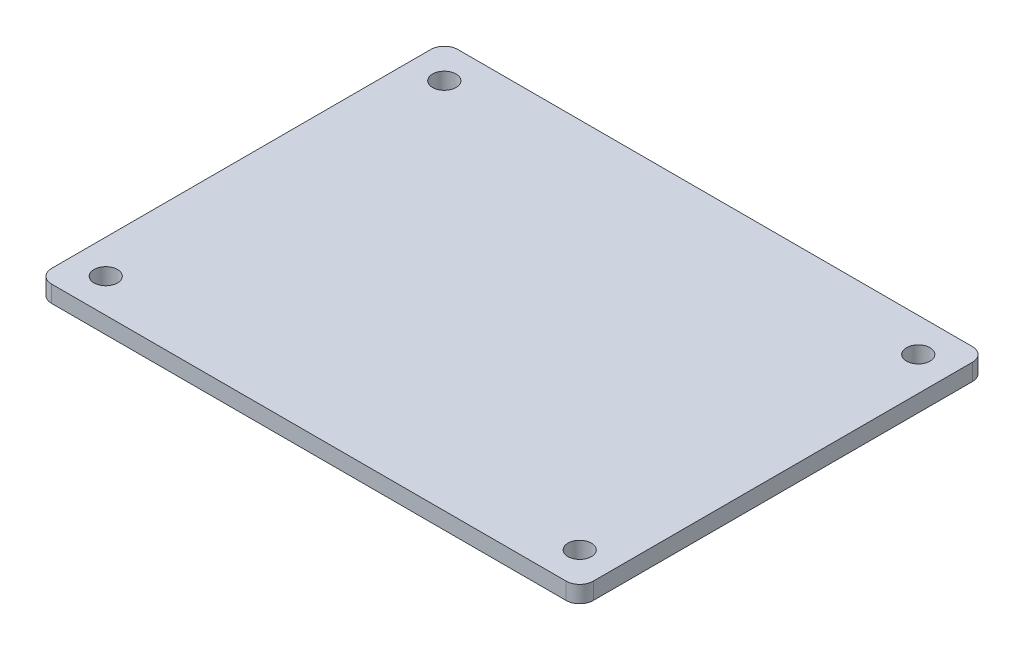
ISO-10303-21;
HEADER;
FILE_DESCRIPTION(('STEP AP214'),'2;1');
FILE_NAME('part.step','',(''),(''),'','','');
FILE_SCHEMA(('AUTOMOTIVE_DESIGN { 1 0 10303 214 1 1 1 1 }'));
ENDSEC;
DATA;
#1=APPLICATION_CONTEXT('core data for automotive mechanical design processes');
#2=APPLICATION_PROTOCOL_DEFINITION('international standard','automotive_design',2000,#1);
#3=PRODUCT_CONTEXT('',#1,'mechanical');
#4=PRODUCT('Part','Part','',(#3));
#5=PRODUCT_RELATED_PRODUCT_CATEGORY('part','',(#4));
#6=PRODUCT_DEFINITION_FORMATION('','',#4);
#7=PRODUCT_DEFINITION_CONTEXT('part definition',#1,'design');
#8=PRODUCT_DEFINITION('design','',#6,#7);
#9=PRODUCT_DEFINITION_SHAPE('','',#8);
#10=(LENGTH_UNIT() NAMED_UNIT(*) SI_UNIT(.MILLI.,.METRE.));
#11=(NAMED_UNIT(*) PLANE_ANGLE_UNIT() SI_UNIT($,.RADIAN.));
#12=(NAMED_UNIT(*) SI_UNIT($,.STERADIAN.) SOLID_ANGLE_UNIT());
#13=UNCERTAINTY_MEASURE_WITH_UNIT(LENGTH_MEASURE(1.E-05),#10,'distance_accuracy_value','');
#14=(GEOMETRIC_REPRESENTATION_CONTEXT(3) GLOBAL_UNCERTAINTY_ASSIGNED_CONTEXT((#13)) GLOBAL_UNIT_ASSIGNED_CONTEXT((#10,
#11,#12)) REPRESENTATION_CONTEXT('',''));
#15=CARTESIAN_POINT('',(0.,0.,0.));
#16=DIRECTION('',(0.,0.,1.));
#17=DIRECTION('',(1.,0.,0.));
#18=AXIS2_PLACEMENT_3D('',#15,#16,#17);
#19=CARTESIAN_POINT('',(25.4,1.5748,0.));
#20=DIRECTION('',(1.,0.,0.));
#21=DIRECTION('',(0.,0.,-1.));
#22=AXIS2_PLACEMENT_3D('',#19,#20,#21);
#23=PLANE('',#22);
#24=DIRECTION('',(0.,0.,1.));
#25=VECTOR('',#24,1.);
#26=CARTESIAN_POINT('',(25.4,0.,0.));
#27=LINE('',#26,#25);
#28=CARTESIAN_POINT('',(25.4,0.,-17.78));
#29=VERTEX_POINT('',#28);
#30=CARTESIAN_POINT('',(25.4,0.,17.78));
#31=VERTEX_POINT('',#30);
#32=EDGE_CURVE('E148',#29,#31,#27,.T.);
#33=ORIENTED_EDGE('',*,*,#32,.F.);
#34=DIRECTION('',(0.,-1.,0.));
#35=VECTOR('',#34,1.);
#36=CARTESIAN_POINT('',(25.4,1.5748,-17.78));
#37=LINE('',#36,#35);
#38=CARTESIAN_POINT('',(25.4,1.5748,-17.78));
#39=VERTEX_POINT('',#38);
#40=EDGE_CURVE('E181',#29,#39,#37,.F.);
#41=ORIENTED_EDGE('',*,*,#40,.T.);
#42=DIRECTION('',(0.,0.,1.));
#43=VECTOR('',#42,1.);
#44=CARTESIAN_POINT('',(25.4,1.5748,0.));
#45=LINE('',#44,#43);
#46=CARTESIAN_POINT('',(25.4,1.5748,17.78));
#47=VERTEX_POINT('',#46);
#48=EDGE_CURVE('E192',#39,#47,#45,.T.);
#49=ORIENTED_EDGE('',*,*,#48,.T.);
#50=DIRECTION('',(0.,-1.,0.));
#51=VECTOR('',#50,1.);
#52=CARTESIAN_POINT('',(25.4,0.,17.78));
#53=LINE('',#52,#51);
#54=EDGE_CURVE('E177',#47,#31,#53,.T.);
#55=ORIENTED_EDGE('',*,*,#54,.T.);
#56=EDGE_LOOP('',(#33,#41,#49,#55));
#57=FACE_BOUND('',#56,.T.);
#58=ADVANCED_FACE('F45',(#57),#23,.T.);
#59=CARTESIAN_POINT('',(0.,1.5748,-19.05));
#60=DIRECTION('',(0.,0.,-1.));
#61=DIRECTION('',(-1.,0.,0.));
#62=AXIS2_PLACEMENT_3D('',#59,#60,#61);
#63=PLANE('',#62);
#64=DIRECTION('',(1.,0.,0.));
#65=VECTOR('',#64,1.);
#66=CARTESIAN_POINT('',(0.,0.,-19.05));
#67=LINE('',#66,#65);
#68=CARTESIAN_POINT('',(-24.13,0.,-19.05));
#69=VERTEX_POINT('',#68);
#70=CARTESIAN_POINT('',(24.13,0.,-19.05));
#71=VERTEX_POINT('',#70);
#72=EDGE_CURVE('E142',#69,#71,#67,.T.);
#73=ORIENTED_EDGE('',*,*,#72,.F.);
#74=DIRECTION('',(0.,-1.,0.));
#75=VECTOR('',#74,1.);
#76=CARTESIAN_POINT('',(-24.13,1.5748,-19.05));
#77=LINE('',#76,#75);
#78=CARTESIAN_POINT('',(-24.13,1.5748,-19.05));
#79=VERTEX_POINT('',#78);
#80=EDGE_CURVE('E117',#69,#79,#77,.F.);
#81=ORIENTED_EDGE('',*,*,#80,.T.);
#82=DIRECTION('',(1.,0.,0.));
#83=VECTOR('',#82,1.);
#84=CARTESIAN_POINT('',(0.,1.5748,-19.05));
#85=LINE('',#84,#83);
#86=CARTESIAN_POINT('',(24.13,1.5748,-19.05));
#87=VERTEX_POINT('',#86);
#88=EDGE_CURVE('E188',#79,#87,#85,.T.);
#89=ORIENTED_EDGE('',*,*,#88,.T.);
#90=DIRECTION('',(0.,-1.,0.));
#91=VECTOR('',#90,1.);
#92=CARTESIAN_POINT('',(24.13,1.5748,-19.05));
#93=LINE('',#92,#91);
#94=EDGE_CURVE('E123',#87,#71,#93,.T.);
#95=ORIENTED_EDGE('',*,*,#94,.T.);
#96=EDGE_LOOP('',(#73,#81,#89,#95));
#97=FACE_BOUND('',#96,.T.);
#98=ADVANCED_FACE('F243',(#97),#63,.T.);
#99=CARTESIAN_POINT('',(-25.4,1.5748,0.));
#100=DIRECTION('',(1.,0.,0.));
#101=DIRECTION('',(0.,0.,-1.));
#102=AXIS2_PLACEMENT_3D('',#99,#100,#101);
#103=PLANE('',#102);
#104=DIRECTION('',(0.,0.,1.));
#105=VECTOR('',#104,1.);
#106=CARTESIAN_POINT('',(-25.4,1.5748,0.));
#107=LINE('',#106,#105);
#108=CARTESIAN_POINT('',(-25.4,1.5748,-17.78));
#109=VERTEX_POINT('',#108);
#110=CARTESIAN_POINT('',(-25.4,1.5748,17.78));
#111=VERTEX_POINT('',#110);
#112=EDGE_CURVE('E132',#109,#111,#107,.T.);
#113=ORIENTED_EDGE('',*,*,#112,.F.);
#114=DIRECTION('',(0.,-1.,0.));
#115=VECTOR('',#114,1.);
#116=CARTESIAN_POINT('',(-25.4,0.,-17.78));
#117=LINE('',#116,#115);
#118=CARTESIAN_POINT('',(-25.4,0.,-17.78));
#119=VERTEX_POINT('',#118);
#120=EDGE_CURVE('E116',#109,#119,#117,.T.);
#121=ORIENTED_EDGE('',*,*,#120,.T.);
#122=DIRECTION('',(0.,0.,1.));
#123=VECTOR('',#122,1.);
#124=CARTESIAN_POINT('',(-25.4,0.,0.));
#125=LINE('',#124,#123);
#126=CARTESIAN_POINT('',(-25.4,0.,17.78));
#127=VERTEX_POINT('',#126);
#128=EDGE_CURVE('E130',#119,#127,#125,.T.);
#129=ORIENTED_EDGE('',*,*,#128,.T.);
#130=DIRECTION('',(0.,-1.,0.));
#131=VECTOR('',#130,1.);
#132=CARTESIAN_POINT('',(-25.4,1.5748,17.78));
#133=LINE('',#132,#131);
#134=EDGE_CURVE('E135',#127,#111,#133,.F.);
#135=ORIENTED_EDGE('',*,*,#134,.T.);
#136=EDGE_LOOP('',(#113,#121,#129,#135));
#137=FACE_BOUND('',#136,.T.);
#138=ADVANCED_FACE('F129',(#137),#103,.F.);
#139=CARTESIAN_POINT('',(-22.225,1.5748,15.875));
#140=DIRECTION('',(0.,-1.,0.));
#141=DIRECTION('',(0.,0.,-1.));
#142=AXIS2_PLACEMENT_3D('',#139,#140,#141);
#143=CYLINDRICAL_SURFACE('',#142,1.1);
#144=CARTESIAN_POINT('',(-22.225,1.5748,15.875));
#145=DIRECTION('',(0.,1.,0.));
#146=DIRECTION('',(0.,0.,1.));
#147=AXIS2_PLACEMENT_3D('',#144,#145,#146);
#148=CIRCLE('',#147,1.1);
#149=CARTESIAN_POINT('',(-22.225,1.5748,16.975));
#150=VERTEX_POINT('',#149);
#151=EDGE_CURVE('E196',#150,#150,#148,.T.);
#152=ORIENTED_EDGE('',*,*,#151,.T.);
#153=EDGE_LOOP('',(#152));
#154=FACE_BOUND('',#153,.T.);
#155=CARTESIAN_POINT('',(-22.225,0.,15.875));
#156=DIRECTION('',(0.,1.,0.));
#157=DIRECTION('',(0.,0.,1.));
#158=AXIS2_PLACEMENT_3D('',#155,#156,#157);
#159=CIRCLE('',#158,1.1);
#160=CARTESIAN_POINT('',(-22.225,0.,16.975));
#161=VERTEX_POINT('',#160);
#162=EDGE_CURVE('E226',#161,#161,#159,.T.);
#163=ORIENTED_EDGE('',*,*,#162,.F.);
#164=EDGE_LOOP('',(#163));
#165=FACE_BOUND('',#164,.T.);
#166=ADVANCED_FACE('F250',(#154,#165),#143,.F.);
#167=CARTESIAN_POINT('',(-22.225,1.5748,-15.875));
#168=DIRECTION('',(0.,-1.,0.));
#169=DIRECTION('',(0.,0.,-1.));
#170=AXIS2_PLACEMENT_3D('',#167,#168,#169);
#171=CYLINDRICAL_SURFACE('',#170,1.1);
#172=CARTESIAN_POINT('',(-22.225,1.5748,-15.875));
#173=DIRECTION('',(0.,1.,0.));
#174=DIRECTION('',(0.,0.,1.));
#175=AXIS2_PLACEMENT_3D('',#172,#173,#174);
#176=CIRCLE('',#175,1.1);
#177=CARTESIAN_POINT('',(-22.225,1.5748,-14.775));
#178=VERTEX_POINT('',#177);
#179=EDGE_CURVE('E200',#178,#178,#176,.T.);
#180=ORIENTED_EDGE('',*,*,#179,.T.);
#181=EDGE_LOOP('',(#180));
#182=FACE_BOUND('',#181,.T.);
#183=CARTESIAN_POINT('',(-22.225,0.,-15.875));
#184=DIRECTION('',(0.,1.,0.));
#185=DIRECTION('',(0.,0.,1.));
#186=AXIS2_PLACEMENT_3D('',#183,#184,#185);
#187=CIRCLE('',#186,1.1);
#188=CARTESIAN_POINT('',(-22.225,0.,-14.775));
#189=VERTEX_POINT('',#188);
#190=EDGE_CURVE('E222',#189,#189,#187,.T.);
#191=ORIENTED_EDGE('',*,*,#190,.F.);
#192=EDGE_LOOP('',(#191));
#193=FACE_BOUND('',#192,.T.);
#194=ADVANCED_FACE('F257',(#182,#193),#171,.F.);
#195=CARTESIAN_POINT('',(22.225,1.5748,15.875));
#196=DIRECTION('',(0.,-1.,0.));
#197=DIRECTION('',(0.,0.,-1.));
#198=AXIS2_PLACEMENT_3D('',#195,#196,#197);
#199=CYLINDRICAL_SURFACE('',#198,1.1);
#200=CARTESIAN_POINT('',(22.225,1.5748,15.875));
#201=DIRECTION('',(0.,1.,0.));
#202=DIRECTION('',(0.,0.,1.));
#203=AXIS2_PLACEMENT_3D('',#200,#201,#202);
#204=CIRCLE('',#203,1.1);
#205=CARTESIAN_POINT('',(22.225,1.5748,16.975));
#206=VERTEX_POINT('',#205);
#207=EDGE_CURVE('E204',#206,#206,#204,.T.);
#208=ORIENTED_EDGE('',*,*,#207,.T.);
#209=EDGE_LOOP('',(#208));
#210=FACE_BOUND('',#209,.T.);
#211=CARTESIAN_POINT('',(22.225,0.,15.875));
#212=DIRECTION('',(0.,1.,0.));
#213=DIRECTION('',(0.,0.,1.));
#214=AXIS2_PLACEMENT_3D('',#211,#212,#213);
#215=CIRCLE('',#214,1.1);
#216=CARTESIAN_POINT('',(22.225,0.,16.975));
#217=VERTEX_POINT('',#216);
#218=EDGE_CURVE('E218',#217,#217,#215,.T.);
#219=ORIENTED_EDGE('',*,*,#218,.F.);
#220=EDGE_LOOP('',(#219));
#221=FACE_BOUND('',#220,.T.);
#222=ADVANCED_FACE('F261',(#210,#221),#199,.F.);
#223=CARTESIAN_POINT('',(22.225,1.5748,-15.875));
#224=DIRECTION('',(0.,-1.,0.));
#225=DIRECTION('',(0.,0.,-1.));
#226=AXIS2_PLACEMENT_3D('',#223,#224,#225);
#227=CYLINDRICAL_SURFACE('',#226,1.1);
#228=CARTESIAN_POINT('',(22.225,1.5748,-15.875));
#229=DIRECTION('',(0.,1.,0.));
#230=DIRECTION('',(0.,0.,1.));
#231=AXIS2_PLACEMENT_3D('',#228,#229,#230);
#232=CIRCLE('',#231,1.1);
#233=CARTESIAN_POINT('',(22.225,1.5748,-14.775));
#234=VERTEX_POINT('',#233);
#235=EDGE_CURVE('E146',#234,#234,#232,.T.);
#236=ORIENTED_EDGE('',*,*,#235,.T.);
#237=EDGE_LOOP('',(#236));
#238=FACE_BOUND('',#237,.T.);
#239=CARTESIAN_POINT('',(22.225,0.,-15.875));
#240=DIRECTION('',(0.,1.,0.));
#241=DIRECTION('',(0.,0.,1.));
#242=AXIS2_PLACEMENT_3D('',#239,#240,#241);
#243=CIRCLE('',#242,1.1);
#244=CARTESIAN_POINT('',(22.225,0.,-14.775));
#245=VERTEX_POINT('',#244);
#246=EDGE_CURVE('E214',#245,#245,#243,.T.);
#247=ORIENTED_EDGE('',*,*,#246,.F.);
#248=EDGE_LOOP('',(#247));
#249=FACE_BOUND('',#248,.T.);
#250=ADVANCED_FACE('F265',(#238,#249),#227,.F.);
#251=CARTESIAN_POINT('',(0.,1.5748,19.05));
#252=DIRECTION('',(0.,0.,-1.));
#253=DIRECTION('',(-1.,0.,0.));
#254=AXIS2_PLACEMENT_3D('',#251,#252,#253);
#255=PLANE('',#254);
#256=DIRECTION('',(1.,0.,0.));
#257=VECTOR('',#256,1.);
#258=CARTESIAN_POINT('',(0.,1.5748,19.05));
#259=LINE('',#258,#257);
#260=CARTESIAN_POINT('',(-24.13,1.5748,19.05));
#261=VERTEX_POINT('',#260);
#262=CARTESIAN_POINT('',(24.13,1.5748,19.05));
#263=VERTEX_POINT('',#262);
#264=EDGE_CURVE('E153',#261,#263,#259,.T.);
#265=ORIENTED_EDGE('',*,*,#264,.F.);
#266=DIRECTION('',(0.,-1.,0.));
#267=VECTOR('',#266,1.);
#268=CARTESIAN_POINT('',(-24.13,1.5748,19.05));
#269=LINE('',#268,#267);
#270=CARTESIAN_POINT('',(-24.13,0.,19.05));
#271=VERTEX_POINT('',#270);
#272=EDGE_CURVE('E11',#261,#271,#269,.T.);
#273=ORIENTED_EDGE('',*,*,#272,.T.);
#274=DIRECTION('',(1.,0.,0.));
#275=VECTOR('',#274,1.);
#276=CARTESIAN_POINT('',(0.,0.,19.05));
#277=LINE('',#276,#275);
#278=CARTESIAN_POINT('',(24.13,0.,19.05));
#279=VERTEX_POINT('',#278);
#280=EDGE_CURVE('E141',#271,#279,#277,.T.);
#281=ORIENTED_EDGE('',*,*,#280,.T.);
#282=DIRECTION('',(0.,-1.,0.));
#283=VECTOR('',#282,1.);
#284=CARTESIAN_POINT('',(24.13,1.5748,19.05));
#285=LINE('',#284,#283);
#286=EDGE_CURVE('E54',#279,#263,#285,.F.);
#287=ORIENTED_EDGE('',*,*,#286,.T.);
#288=EDGE_LOOP('',(#265,#273,#281,#287));
#289=FACE_BOUND('',#288,.T.);
#290=ADVANCED_FACE('F269',(#289),#255,.F.);
#291=CARTESIAN_POINT('',(0.,1.5748,0.));
#292=DIRECTION('',(0.,1.,0.));
#293=DIRECTION('',(0.,0.,1.));
#294=AXIS2_PLACEMENT_3D('',#291,#292,#293);
#295=PLANE('',#294);
#296=ORIENTED_EDGE('',*,*,#235,.F.);
#297=EDGE_LOOP('',(#296));
#298=FACE_BOUND('',#297,.T.);
#299=ORIENTED_EDGE('',*,*,#207,.F.);
#300=EDGE_LOOP('',(#299));
#301=FACE_BOUND('',#300,.T.);
#302=ORIENTED_EDGE('',*,*,#179,.F.);
#303=EDGE_LOOP('',(#302));
#304=FACE_BOUND('',#303,.T.);
#305=ORIENTED_EDGE('',*,*,#151,.F.);
#306=EDGE_LOOP('',(#305));
#307=FACE_BOUND('',#306,.T.);
#308=ORIENTED_EDGE('',*,*,#88,.F.);
#309=CARTESIAN_POINT('',(-24.13,1.5748,-17.78));
#310=DIRECTION('',(0.,1.,0.));
#311=DIRECTION('',(0.,0.,1.));
#312=AXIS2_PLACEMENT_3D('',#309,#310,#311);
#313=CIRCLE('',#312,1.27);
#314=EDGE_CURVE('E174',#79,#109,#313,.T.);
#315=ORIENTED_EDGE('',*,*,#314,.T.);
#316=ORIENTED_EDGE('',*,*,#112,.T.);
#317=CARTESIAN_POINT('',(-24.13,1.5748,17.78));
#318=DIRECTION('',(0.,1.,0.));
#319=DIRECTION('',(0.,0.,1.));
#320=AXIS2_PLACEMENT_3D('',#317,#318,#319);
#321=CIRCLE('',#320,1.27);
#322=EDGE_CURVE('E67',#111,#261,#321,.T.);
#323=ORIENTED_EDGE('',*,*,#322,.T.);
#324=ORIENTED_EDGE('',*,*,#264,.T.);
#325=CARTESIAN_POINT('',(24.13,1.5748,17.78));
#326=DIRECTION('',(0.,1.,0.));
#327=DIRECTION('',(0.,0.,1.));
#328=AXIS2_PLACEMENT_3D('',#325,#326,#327);
#329=CIRCLE('',#328,1.27);
#330=EDGE_CURVE('E166',#263,#47,#329,.T.);
#331=ORIENTED_EDGE('',*,*,#330,.T.);
#332=ORIENTED_EDGE('',*,*,#48,.F.);
#333=CARTESIAN_POINT('',(24.13,1.5748,-17.78));
#334=DIRECTION('',(0.,1.,0.));
#335=DIRECTION('',(0.,0.,1.));
#336=AXIS2_PLACEMENT_3D('',#333,#334,#335);
#337=CIRCLE('',#336,1.27);
#338=EDGE_CURVE('E171',#39,#87,#337,.T.);
#339=ORIENTED_EDGE('',*,*,#338,.T.);
#340=EDGE_LOOP('',(#308,#315,#316,#323,#324,#331,#332,#339));
#341=FACE_BOUND('',#340,.T.);
#342=ADVANCED_FACE('F241',(#298,#301,#304,#307,#341),#295,.T.);
#343=CARTESIAN_POINT('',(0.,0.,0.));
#344=DIRECTION('',(0.,1.,0.));
#345=DIRECTION('',(0.,0.,1.));
#346=AXIS2_PLACEMENT_3D('',#343,#344,#345);
#347=PLANE('',#346);
#348=ORIENTED_EDGE('',*,*,#246,.T.);
#349=EDGE_LOOP('',(#348));
#350=FACE_BOUND('',#349,.T.);
#351=ORIENTED_EDGE('',*,*,#218,.T.);
#352=EDGE_LOOP('',(#351));
#353=FACE_BOUND('',#352,.T.);
#354=ORIENTED_EDGE('',*,*,#190,.T.);
#355=EDGE_LOOP('',(#354));
#356=FACE_BOUND('',#355,.T.);
#357=ORIENTED_EDGE('',*,*,#162,.T.);
#358=EDGE_LOOP('',(#357));
#359=FACE_BOUND('',#358,.T.);
#360=ORIENTED_EDGE('',*,*,#128,.F.);
#361=CARTESIAN_POINT('',(-24.13,0.,-17.78));
#362=DIRECTION('',(0.,1.,0.));
#363=DIRECTION('',(0.,0.,1.));
#364=AXIS2_PLACEMENT_3D('',#361,#362,#363);
#365=CIRCLE('',#364,1.27);
#366=EDGE_CURVE('E112',#119,#69,#365,.F.);
#367=ORIENTED_EDGE('',*,*,#366,.T.);
#368=ORIENTED_EDGE('',*,*,#72,.T.);
#369=CARTESIAN_POINT('',(24.13,0.,-17.78));
#370=DIRECTION('',(0.,1.,0.));
#371=DIRECTION('',(0.,0.,1.));
#372=AXIS2_PLACEMENT_3D('',#369,#370,#371);
#373=CIRCLE('',#372,1.27);
#374=EDGE_CURVE('E124',#71,#29,#373,.F.);
#375=ORIENTED_EDGE('',*,*,#374,.T.);
#376=ORIENTED_EDGE('',*,*,#32,.T.);
#377=CARTESIAN_POINT('',(24.13,0.,17.78));
#378=DIRECTION('',(0.,1.,0.));
#379=DIRECTION('',(0.,0.,1.));
#380=AXIS2_PLACEMENT_3D('',#377,#378,#379);
#381=CIRCLE('',#380,1.27);
#382=EDGE_CURVE('E134',#31,#279,#381,.F.);
#383=ORIENTED_EDGE('',*,*,#382,.T.);
#384=ORIENTED_EDGE('',*,*,#280,.F.);
#385=CARTESIAN_POINT('',(-24.13,0.,17.78));
#386=DIRECTION('',(0.,1.,0.));
#387=DIRECTION('',(0.,0.,1.));
#388=AXIS2_PLACEMENT_3D('',#385,#386,#387);
#389=CIRCLE('',#388,1.27);
#390=EDGE_CURVE('E139',#271,#127,#389,.F.);
#391=ORIENTED_EDGE('',*,*,#390,.T.);
#392=EDGE_LOOP('',(#360,#367,#368,#375,#376,#383,#384,#391));
#393=FACE_BOUND('',#392,.T.);
#394=ADVANCED_FACE('F137',(#350,#353,#356,#359,#393),#347,.F.);
#395=CARTESIAN_POINT('',(-24.13,1.5748,-17.78));
#396=DIRECTION('',(0.,1.,0.));
#397=DIRECTION('',(0.,0.,1.));
#398=AXIS2_PLACEMENT_3D('',#395,#396,#397);
#399=CYLINDRICAL_SURFACE('',#398,1.27);
#400=ORIENTED_EDGE('',*,*,#314,.F.);
#401=ORIENTED_EDGE('',*,*,#80,.F.);
#402=ORIENTED_EDGE('',*,*,#366,.F.);
#403=ORIENTED_EDGE('',*,*,#120,.F.);
#404=EDGE_LOOP('',(#400,#401,#402,#403));
#405=FACE_BOUND('',#404,.T.);
#406=ADVANCED_FACE('F115',(#405),#399,.T.);
#407=CARTESIAN_POINT('',(24.13,1.5748,-17.78));
#408=DIRECTION('',(0.,-1.,0.));
#409=DIRECTION('',(0.,0.,-1.));
#410=AXIS2_PLACEMENT_3D('',#407,#408,#409);
#411=CYLINDRICAL_SURFACE('',#410,1.27);
#412=ORIENTED_EDGE('',*,*,#338,.F.);
#413=ORIENTED_EDGE('',*,*,#40,.F.);
#414=ORIENTED_EDGE('',*,*,#374,.F.);
#415=ORIENTED_EDGE('',*,*,#94,.F.);
#416=EDGE_LOOP('',(#412,#413,#414,#415));
#417=FACE_BOUND('',#416,.T.);
#418=ADVANCED_FACE('F238',(#417),#411,.T.);
#419=CARTESIAN_POINT('',(-24.13,1.5748,17.78));
#420=DIRECTION('',(0.,-1.,0.));
#421=DIRECTION('',(0.,0.,-1.));
#422=AXIS2_PLACEMENT_3D('',#419,#420,#421);
#423=CYLINDRICAL_SURFACE('',#422,1.27);
#424=ORIENTED_EDGE('',*,*,#322,.F.);
#425=ORIENTED_EDGE('',*,*,#134,.F.);
#426=ORIENTED_EDGE('',*,*,#390,.F.);
#427=ORIENTED_EDGE('',*,*,#272,.F.);
#428=EDGE_LOOP('',(#424,#425,#426,#427));
#429=FACE_BOUND('',#428,.T.);
#430=ADVANCED_FACE('F273',(#429),#423,.T.);
#431=CARTESIAN_POINT('',(24.13,1.5748,17.78));
#432=DIRECTION('',(0.,1.,0.));
#433=DIRECTION('',(0.,0.,1.));
#434=AXIS2_PLACEMENT_3D('',#431,#432,#433);
#435=CYLINDRICAL_SURFACE('',#434,1.27);
#436=ORIENTED_EDGE('',*,*,#330,.F.);
#437=ORIENTED_EDGE('',*,*,#286,.F.);
#438=ORIENTED_EDGE('',*,*,#382,.F.);
#439=ORIENTED_EDGE('',*,*,#54,.F.);
#440=EDGE_LOOP('',(#436,#437,#438,#439));
#441=FACE_BOUND('',#440,.T.);
#442=ADVANCED_FACE('F47',(#441),#435,.T.);
#443=CLOSED_SHELL('',(#58,#98,#138,#166,#194,#222,#250,#290,#342,#394,#406,#418,#430,#442));
#444=MANIFOLD_SOLID_BREP('B2',#443);
#445=ADVANCED_BREP_SHAPE_REPRESENTATION('',(#18,#444),#14);
#446=SHAPE_DEFINITION_REPRESENTATION(#9,#445);
ENDSEC;
END-ISO-10303-21;
